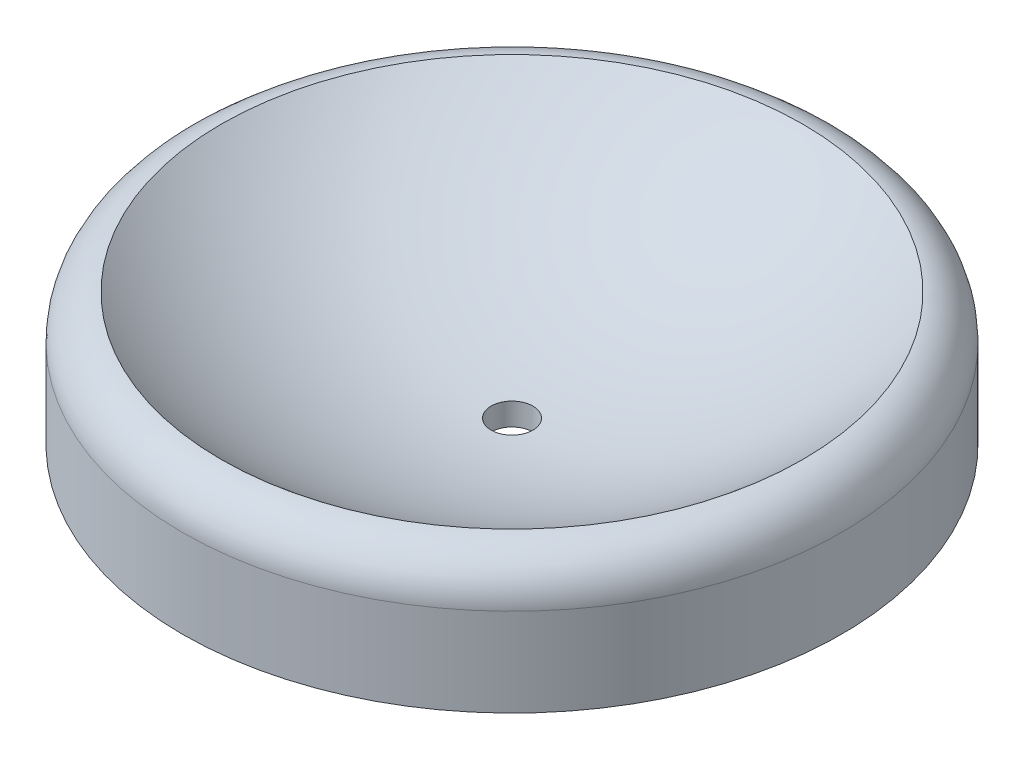
ISO-10303-21;
HEADER;
FILE_DESCRIPTION(('STEP AP214'),'2;1');
FILE_NAME('part.step','',(''),(''),'','','');
FILE_SCHEMA(('AUTOMOTIVE_DESIGN { 1 0 10303 214 1 1 1 1 }'));
ENDSEC;
DATA;
#1=APPLICATION_CONTEXT('core data for automotive mechanical design processes');
#2=APPLICATION_PROTOCOL_DEFINITION('international standard','automotive_design',2000,#1);
#3=PRODUCT_CONTEXT('',#1,'mechanical');
#4=PRODUCT('Part','Part','',(#3));
#5=PRODUCT_RELATED_PRODUCT_CATEGORY('part','',(#4));
#6=PRODUCT_DEFINITION_FORMATION('','',#4);
#7=PRODUCT_DEFINITION_CONTEXT('part definition',#1,'design');
#8=PRODUCT_DEFINITION('design','',#6,#7);
#9=PRODUCT_DEFINITION_SHAPE('','',#8);
#10=(LENGTH_UNIT() NAMED_UNIT(*) SI_UNIT(.MILLI.,.METRE.));
#11=(NAMED_UNIT(*) PLANE_ANGLE_UNIT() SI_UNIT($,.RADIAN.));
#12=(NAMED_UNIT(*) SI_UNIT($,.STERADIAN.) SOLID_ANGLE_UNIT());
#13=UNCERTAINTY_MEASURE_WITH_UNIT(LENGTH_MEASURE(1.E-05),#10,'distance_accuracy_value','');
#14=(GEOMETRIC_REPRESENTATION_CONTEXT(3) GLOBAL_UNCERTAINTY_ASSIGNED_CONTEXT((#13)) GLOBAL_UNIT_ASSIGNED_CONTEXT((#10,
#11,#12)) REPRESENTATION_CONTEXT('',''));
#15=CARTESIAN_POINT('',(0.,0.,0.));
#16=DIRECTION('',(0.,0.,1.));
#17=DIRECTION('',(1.,0.,0.));
#18=AXIS2_PLACEMENT_3D('',#15,#16,#17);
#19=CARTESIAN_POINT('',(0.,6.,0.));
#20=DIRECTION('',(0.,-1.,0.));
#21=DIRECTION('',(0.,0.,-1.));
#22=AXIS2_PLACEMENT_3D('',#19,#20,#21);
#23=CYLINDRICAL_SURFACE('',#22,15.);
#24=CARTESIAN_POINT('',(0.,4.01312545982471,0.));
#25=DIRECTION('',(0.,1.,0.));
#26=DIRECTION('',(0.,0.,1.));
#27=AXIS2_PLACEMENT_3D('',#24,#25,#26);
#28=CIRCLE('',#27,15.);
#29=CARTESIAN_POINT('',(0.,4.01312545982471,15.));
#30=VERTEX_POINT('',#29);
#31=EDGE_CURVE('E10',#30,#30,#28,.F.);
#32=ORIENTED_EDGE('',*,*,#31,.T.);
#33=EDGE_LOOP('',(#32));
#34=FACE_BOUND('',#33,.T.);
#35=CARTESIAN_POINT('',(0.,0.,0.));
#36=DIRECTION('',(0.,1.,0.));
#37=DIRECTION('',(0.,0.,1.));
#38=AXIS2_PLACEMENT_3D('',#35,#36,#37);
#39=CIRCLE('',#38,15.);
#40=CARTESIAN_POINT('',(0.,0.,15.));
#41=VERTEX_POINT('',#40);
#42=EDGE_CURVE('E43',#41,#41,#39,.T.);
#43=ORIENTED_EDGE('',*,*,#42,.T.);
#44=EDGE_LOOP('',(#43));
#45=FACE_BOUND('',#44,.T.);
#46=ADVANCED_FACE('F36',(#34,#45),#23,.T.);
#47=CARTESIAN_POINT('',(0.,0.,0.));
#48=DIRECTION('',(0.,1.,0.));
#49=DIRECTION('',(0.,0.,1.));
#50=AXIS2_PLACEMENT_3D('',#47,#48,#49);
#51=PLANE('',#50);
#52=CARTESIAN_POINT('',(0.,0.,0.));
#53=DIRECTION('',(0.,1.,0.));
#54=DIRECTION('',(0.,0.,1.));
#55=AXIS2_PLACEMENT_3D('',#52,#53,#54);
#56=CIRCLE('',#55,0.95);
#57=CARTESIAN_POINT('',(0.,0.,0.95));
#58=VERTEX_POINT('',#57);
#59=EDGE_CURVE('E47',#58,#58,#56,.F.);
#60=ORIENTED_EDGE('',*,*,#59,.F.);
#61=EDGE_LOOP('',(#60));
#62=FACE_BOUND('',#61,.T.);
#63=ORIENTED_EDGE('',*,*,#42,.F.);
#64=EDGE_LOOP('',(#63));
#65=FACE_BOUND('',#64,.T.);
#66=ADVANCED_FACE('F72',(#62,#65),#51,.F.);
#67=CARTESIAN_POINT('',(0.,16.,0.));
#68=DIRECTION('',(0.,-1.,0.));
#69=DIRECTION('',(0.,0.,-1.));
#70=AXIS2_PLACEMENT_3D('',#67,#68,#69);
#71=CYLINDRICAL_SURFACE('',#70,0.95);
#72=CARTESIAN_POINT('',(0.,1.0225752410377,0.));
#73=DIRECTION('',(0.,1.,0.));
#74=DIRECTION('',(0.,0.,1.));
#75=AXIS2_PLACEMENT_3D('',#72,#73,#74);
#76=CIRCLE('',#75,0.95);
#77=CARTESIAN_POINT('',(0.,1.0225752410377,0.95));
#78=VERTEX_POINT('',#77);
#79=EDGE_CURVE('E55',#78,#78,#76,.F.);
#80=ORIENTED_EDGE('',*,*,#79,.F.);
#81=EDGE_LOOP('',(#80));
#82=FACE_BOUND('',#81,.T.);
#83=ORIENTED_EDGE('',*,*,#59,.T.);
#84=EDGE_LOOP('',(#83));
#85=FACE_BOUND('',#84,.T.);
#86=ADVANCED_FACE('F69',(#82,#85),#71,.F.);
#87=CARTESIAN_POINT('',(0.,21.,0.));
#88=DIRECTION('',(0.,0.,1.));
#89=DIRECTION('',(0.,1.,0.));
#90=AXIS2_PLACEMENT_3D('',#87,#88,#89);
#91=SPHERICAL_SURFACE('',#90,20.);
#92=CARTESIAN_POINT('',(0.,21.,0.));
#93=DIRECTION('',(0.,1.,0.));
#94=DIRECTION('',(0.,0.,1.));
#95=AXIS2_PLACEMENT_3D('',#92,#93,#94);
#96=SPHERICAL_SURFACE('',#95,20.);
#97=CARTESIAN_POINT('',(0.,6.,0.));
#98=DIRECTION('',(0.,1.,0.));
#99=DIRECTION('',(0.,0.,1.));
#100=AXIS2_PLACEMENT_3D('',#97,#98,#99);
#101=CIRCLE('',#100,13.228756555323);
#102=CARTESIAN_POINT('',(0.,6.,13.228756555323));
#103=VERTEX_POINT('',#102);
#104=EDGE_CURVE('E52',#103,#103,#101,.T.);
#105=ORIENTED_EDGE('',*,*,#104,.T.);
#106=EDGE_LOOP('',(#105));
#107=FACE_BOUND('',#106,.T.);
#108=ORIENTED_EDGE('',*,*,#79,.T.);
#109=EDGE_LOOP('',(#108));
#110=FACE_BOUND('',#109,.T.);
#111=ADVANCED_FACE('F62',(#107,#110),#96,.F.);
#112=CARTESIAN_POINT('',(0.,4.01312545982471,0.));
#113=DIRECTION('',(0.,1.,0.));
#114=DIRECTION('',(0.,0.,1.));
#115=AXIS2_PLACEMENT_3D('',#112,#113,#114);
#116=TOROIDAL_SURFACE('',#115,13.,2.);
#117=ORIENTED_EDGE('',*,*,#31,.F.);
#118=EDGE_LOOP('',(#117));
#119=FACE_BOUND('',#118,.T.);
#120=ORIENTED_EDGE('',*,*,#104,.F.);
#121=EDGE_LOOP('',(#120));
#122=FACE_BOUND('',#121,.T.);
#123=ADVANCED_FACE('F38',(#119,#122),#116,.T.);
#124=CLOSED_SHELL('',(#46,#66,#86,#111,#123));
#125=MANIFOLD_SOLID_BREP('B2',#124);
#126=ADVANCED_BREP_SHAPE_REPRESENTATION('',(#18,#125),#14);
#127=SHAPE_DEFINITION_REPRESENTATION(#9,#126);
ENDSEC;
END-ISO-10303-21;
